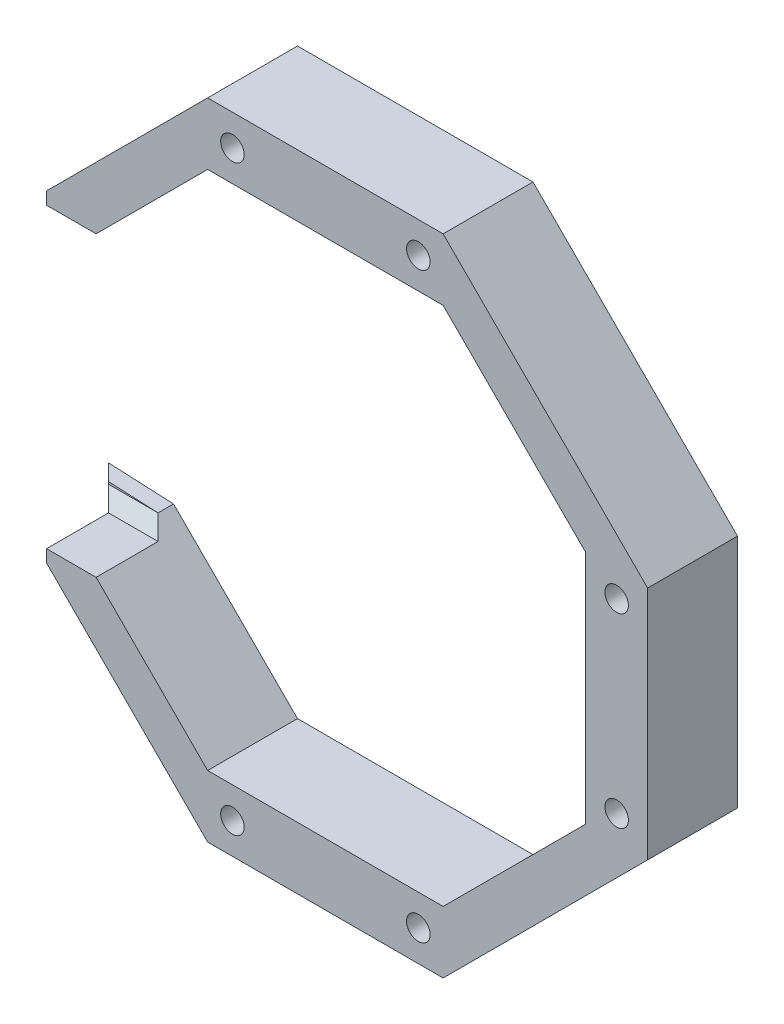
ISO-10303-21;
HEADER;
FILE_DESCRIPTION(('STEP AP214'),'2;1');
FILE_NAME('part.step','',(''),(''),'','','');
FILE_SCHEMA(('AUTOMOTIVE_DESIGN { 1 0 10303 214 1 1 1 1 }'));
ENDSEC;
DATA;
#1=APPLICATION_CONTEXT('core data for automotive mechanical design processes');
#2=APPLICATION_PROTOCOL_DEFINITION('international standard','automotive_design',2000,#1);
#3=PRODUCT_CONTEXT('',#1,'mechanical');
#4=PRODUCT('Part','Part','',(#3));
#5=PRODUCT_RELATED_PRODUCT_CATEGORY('part','',(#4));
#6=PRODUCT_DEFINITION_FORMATION('','',#4);
#7=PRODUCT_DEFINITION_CONTEXT('part definition',#1,'design');
#8=PRODUCT_DEFINITION('design','',#6,#7);
#9=PRODUCT_DEFINITION_SHAPE('','',#8);
#10=(LENGTH_UNIT() NAMED_UNIT(*) SI_UNIT(.MILLI.,.METRE.));
#11=(NAMED_UNIT(*) PLANE_ANGLE_UNIT() SI_UNIT($,.RADIAN.));
#12=(NAMED_UNIT(*) SI_UNIT($,.STERADIAN.) SOLID_ANGLE_UNIT());
#13=UNCERTAINTY_MEASURE_WITH_UNIT(LENGTH_MEASURE(1.E-05),#10,'distance_accuracy_value','');
#14=(GEOMETRIC_REPRESENTATION_CONTEXT(3) GLOBAL_UNCERTAINTY_ASSIGNED_CONTEXT((#13)) GLOBAL_UNIT_ASSIGNED_CONTEXT((#10,
#11,#12)) REPRESENTATION_CONTEXT('',''));
#15=CARTESIAN_POINT('',(0.,0.,0.));
#16=DIRECTION('',(0.,0.,1.));
#17=DIRECTION('',(1.,0.,0.));
#18=AXIS2_PLACEMENT_3D('',#15,#16,#17);
#19=CARTESIAN_POINT('',(0.,0.,-65.2));
#20=DIRECTION('',(0.,0.,1.));
#21=DIRECTION('',(1.,0.,0.));
#22=AXIS2_PLACEMENT_3D('',#19,#20,#21);
#23=PLANE('',#22);
#24=DIRECTION('',(-0.998868137724438,-0.0475651494154494,0.));
#25=VECTOR('',#24,1.);
#26=CARTESIAN_POINT('',(1.42103179550905,-29.84166770569,-65.2));
#27=LINE('',#26,#25);
#28=CARTESIAN_POINT('',(60.988658439,-27.005114056,-65.2));
#29=VERTEX_POINT('',#28);
#30=CARTESIAN_POINT('',(52.988658439,-27.3860664369524,-65.2));
#31=VERTEX_POINT('',#30);
#32=EDGE_CURVE('E374',#29,#31,#27,.T.);
#33=ORIENTED_EDGE('',*,*,#32,.F.);
#34=DIRECTION('',(1.,0.,0.));
#35=VECTOR('',#34,1.);
#36=CARTESIAN_POINT('',(36.8219917723334,-27.0051140559999,-65.2));
#37=LINE('',#36,#35);
#38=CARTESIAN_POINT('',(52.988658439,-27.005114056,-65.2));
#39=VERTEX_POINT('',#38);
#40=EDGE_CURVE('E418',#29,#39,#37,.F.);
#41=ORIENTED_EDGE('',*,*,#40,.T.);
#42=DIRECTION('',(0.,1.,0.));
#43=VECTOR('',#42,1.);
#44=CARTESIAN_POINT('',(52.988658439,-70.505114056,-65.2));
#45=LINE('',#44,#43);
#46=EDGE_CURVE('E65',#39,#31,#45,.F.);
#47=ORIENTED_EDGE('',*,*,#46,.T.);
#48=EDGE_LOOP('',(#33,#41,#47));
#49=FACE_BOUND('',#48,.T.);
#50=ADVANCED_FACE('F49',(#49),#23,.T.);
#51=CARTESIAN_POINT('',(50.488658439,-70.505114056,-67.7));
#52=DIRECTION('',(-0.70710678118655,0.,0.707106781186545));
#53=DIRECTION('',(0.707106781186545,0.,0.70710678118655));
#54=AXIS2_PLACEMENT_3D('',#51,#52,#53);
#55=PLANE('',#54);
#56=DIRECTION('',(-0.577350269189624,-0.577350269189624,-0.577350269189629));
#57=VECTOR('',#56,1.);
#58=CARTESIAN_POINT('',(36.1553251056667,-41.8384473893333,-82.0333333333334));
#59=LINE('',#58,#57);
#60=CARTESIAN_POINT('',(50.488658439,-27.505114056,-67.7));
#61=VERTEX_POINT('',#60);
#62=CARTESIAN_POINT('',(54.9886584389999,-23.005114056,-63.2));
#63=VERTEX_POINT('',#62);
#64=EDGE_CURVE('E353',#61,#63,#59,.F.);
#65=ORIENTED_EDGE('',*,*,#64,.F.);
#66=DIRECTION('',(-0.706706267542865,-0.0336526794068031,-0.70670626754287));
#67=VECTOR('',#66,1.);
#68=CARTESIAN_POINT('',(49.4660083823749,-27.5538116777441,-68.7226500566251));
#69=LINE('',#68,#67);
#70=EDGE_CURVE('E378',#61,#31,#69,.F.);
#71=ORIENTED_EDGE('',*,*,#70,.T.);
#72=ORIENTED_EDGE('',*,*,#46,.F.);
#73=DIRECTION('',(-0.577350269189624,-0.577350269189624,-0.577350269189629));
#74=VECTOR('',#73,1.);
#75=CARTESIAN_POINT('',(52.3219917723333,-27.6717807226667,-65.8666666666667));
#76=LINE('',#75,#74);
#77=CARTESIAN_POINT('',(54.9886584389999,-25.005114056,-63.2));
#78=VERTEX_POINT('',#77);
#79=EDGE_CURVE('E406',#39,#78,#76,.F.);
#80=ORIENTED_EDGE('',*,*,#79,.T.);
#81=DIRECTION('',(0.,1.,0.));
#82=VECTOR('',#81,1.);
#83=CARTESIAN_POINT('',(54.9886584389999,-70.505114056,-63.2));
#84=LINE('',#83,#82);
#85=EDGE_CURVE('E359',#63,#78,#84,.F.);
#86=ORIENTED_EDGE('',*,*,#85,.F.);
#87=EDGE_LOOP('',(#65,#71,#72,#80,#86));
#88=FACE_BOUND('',#87,.T.);
#89=ADVANCED_FACE('F305',(#88),#55,.T.);
#90=DIRECTION('',(0.998868137724438,-0.0475651494154494,0.));
#91=VECTOR('',#90,1.);
#92=CARTESIAN_POINT('',(-3.23556275279864,-67.9468178087715,-65.2));
#93=LINE('',#92,#91);
#94=CARTESIAN_POINT('',(52.988658439,-70.6241616750476,-65.2));
#95=VERTEX_POINT('',#94);
#96=CARTESIAN_POINT('',(60.988658439,-71.005114056,-65.2));
#97=VERTEX_POINT('',#96);
#98=EDGE_CURVE('E325',#95,#97,#93,.T.);
#99=ORIENTED_EDGE('',*,*,#98,.F.);
#100=CARTESIAN_POINT('',(52.988658439,-71.005114056,-65.2));
#101=VERTEX_POINT('',#100);
#102=EDGE_CURVE('E73',#95,#101,#45,.F.);
#103=ORIENTED_EDGE('',*,*,#102,.T.);
#104=DIRECTION('',(1.,0.,0.));
#105=VECTOR('',#104,1.);
#106=CARTESIAN_POINT('',(51.1553251056666,-71.005114056,-65.2));
#107=LINE('',#106,#105);
#108=EDGE_CURVE('E326',#101,#97,#107,.T.);
#109=ORIENTED_EDGE('',*,*,#108,.T.);
#110=EDGE_LOOP('',(#99,#103,#109));
#111=FACE_BOUND('',#110,.T.);
#112=ADVANCED_FACE('F308',(#111),#23,.T.);
#113=CARTESIAN_POINT('',(70.988658439,-81.005114056,-63.2));
#114=DIRECTION('',(-0.707106781186548,-0.707106781186548,0.));
#115=DIRECTION('',(-0.707106781186548,0.707106781186548,0.));
#116=AXIS2_PLACEMENT_3D('',#113,#114,#115);
#117=PLANE('',#116);
#118=DIRECTION('',(0.,0.,-1.));
#119=VECTOR('',#118,1.);
#120=CARTESIAN_POINT('',(60.988658439,-71.005114056,-65.2));
#121=LINE('',#120,#119);
#122=CARTESIAN_POINT('',(60.988658439,-71.005114056,-67.7));
#123=VERTEX_POINT('',#122);
#124=EDGE_CURVE('E720',#97,#123,#121,.T.);
#125=ORIENTED_EDGE('',*,*,#124,.F.);
#126=DIRECTION('',(0.577350269189625,-0.577350269189625,0.577350269189629));
#127=VECTOR('',#126,1.);
#128=CARTESIAN_POINT('',(68.3219917723333,-78.3384473893333,-57.8666666666667));
#129=LINE('',#128,#127);
#130=CARTESIAN_POINT('',(62.988658439,-73.005114056,-63.2));
#131=VERTEX_POINT('',#130);
#132=EDGE_CURVE('E415',#97,#131,#129,.T.);
#133=ORIENTED_EDGE('',*,*,#132,.T.);
#134=DIRECTION('',(0.,0.,-1.));
#135=VECTOR('',#134,1.);
#136=CARTESIAN_POINT('',(62.988658439,-73.005114056,-53.2));
#137=LINE('',#136,#135);
#138=CARTESIAN_POINT('',(62.988658439,-73.005114056,-53.2));
#139=VERTEX_POINT('',#138);
#140=EDGE_CURVE('E602',#139,#131,#137,.T.);
#141=ORIENTED_EDGE('',*,*,#140,.F.);
#142=DIRECTION('',(-0.707106781186547,0.707106781186547,0.));
#143=VECTOR('',#142,1.);
#144=CARTESIAN_POINT('',(62.988658439,-73.005114056,-53.2));
#145=LINE('',#144,#143);
#146=CARTESIAN_POINT('',(80.988658439,-91.005114056,-53.2));
#147=VERTEX_POINT('',#146);
#148=EDGE_CURVE('E879',#147,#139,#145,.T.);
#149=ORIENTED_EDGE('',*,*,#148,.F.);
#150=DIRECTION('',(0.,0.,-1.));
#151=VECTOR('',#150,1.);
#152=CARTESIAN_POINT('',(80.988658439,-91.005114056,-63.2));
#153=LINE('',#152,#151);
#154=CARTESIAN_POINT('',(80.988658439,-91.005114056,-67.7));
#155=VERTEX_POINT('',#154);
#156=EDGE_CURVE('E687',#147,#155,#153,.T.);
#157=ORIENTED_EDGE('',*,*,#156,.T.);
#158=DIRECTION('',(-0.707106781186548,0.707106781186548,0.));
#159=VECTOR('',#158,1.);
#160=CARTESIAN_POINT('',(80.988658439,-91.005114056,-67.7));
#161=LINE('',#160,#159);
#162=EDGE_CURVE('E363',#155,#123,#161,.T.);
#163=ORIENTED_EDGE('',*,*,#162,.T.);
#164=EDGE_LOOP('',(#125,#133,#141,#149,#157,#163));
#165=FACE_BOUND('',#164,.T.);
#166=ADVANCED_FACE('F318',(#165),#117,.F.);
#167=CARTESIAN_POINT('',(99.988658439,-91.005114056,-63.2));
#168=DIRECTION('',(0.,-1.,0.));
#169=DIRECTION('',(0.,0.,-1.));
#170=AXIS2_PLACEMENT_3D('',#167,#168,#169);
#171=PLANE('',#170);
#172=ORIENTED_EDGE('',*,*,#156,.F.);
#173=DIRECTION('',(-1.,0.,0.));
#174=VECTOR('',#173,1.);
#175=CARTESIAN_POINT('',(80.988658439,-91.005114056,-53.2));
#176=LINE('',#175,#174);
#177=CARTESIAN_POINT('',(118.988658439,-91.005114056,-53.2));
#178=VERTEX_POINT('',#177);
#179=EDGE_CURVE('E877',#178,#147,#176,.T.);
#180=ORIENTED_EDGE('',*,*,#179,.F.);
#181=DIRECTION('',(0.,0.,-1.));
#182=VECTOR('',#181,1.);
#183=CARTESIAN_POINT('',(118.988658439,-91.005114056,-63.2));
#184=LINE('',#183,#182);
#185=CARTESIAN_POINT('',(118.988658439,-91.005114056,-67.7));
#186=VERTEX_POINT('',#185);
#187=EDGE_CURVE('E345',#178,#186,#184,.T.);
#188=ORIENTED_EDGE('',*,*,#187,.T.);
#189=DIRECTION('',(-1.,0.,0.));
#190=VECTOR('',#189,1.);
#191=CARTESIAN_POINT('',(118.988658439,-91.005114056,-67.7));
#192=LINE('',#191,#190);
#193=EDGE_CURVE('E703',#186,#155,#192,.T.);
#194=ORIENTED_EDGE('',*,*,#193,.T.);
#195=EDGE_LOOP('',(#172,#180,#188,#194));
#196=FACE_BOUND('',#195,.T.);
#197=ADVANCED_FACE('F322',(#196),#171,.F.);
#198=CARTESIAN_POINT('',(64.488658439,-84.505114056,-63.2));
#199=DIRECTION('',(-0.707106781186548,-0.707106781186548,0.));
#200=DIRECTION('',(-0.707106781186548,0.707106781186548,0.));
#201=AXIS2_PLACEMENT_3D('',#198,#199,#200);
#202=PLANE('',#201);
#203=DIRECTION('',(-0.707106781186548,0.707106781186548,0.));
#204=VECTOR('',#203,1.);
#205=CARTESIAN_POINT('',(80.988658439,-101.005114056,-67.7));
#206=LINE('',#205,#204);
#207=CARTESIAN_POINT('',(80.9886584389999,-101.005114056,-67.7));
#208=VERTEX_POINT('',#207);
#209=CARTESIAN_POINT('',(50.488658439,-70.505114056,-67.7));
#210=VERTEX_POINT('',#209);
#211=EDGE_CURVE('E352',#208,#210,#206,.T.);
#212=ORIENTED_EDGE('',*,*,#211,.F.);
#213=DIRECTION('',(0.,0.,1.));
#214=VECTOR('',#213,1.);
#215=CARTESIAN_POINT('',(80.9886584389999,-101.005114056,-63.2));
#216=LINE('',#215,#214);
#217=CARTESIAN_POINT('',(80.9886584389999,-101.005114056,-53.2));
#218=VERTEX_POINT('',#217);
#219=EDGE_CURVE('E403',#208,#218,#216,.T.);
#220=ORIENTED_EDGE('',*,*,#219,.T.);
#221=DIRECTION('',(0.707106781186547,-0.707106781186547,0.));
#222=VECTOR('',#221,1.);
#223=CARTESIAN_POINT('',(80.9886584389999,-101.005114056,-53.2));
#224=LINE('',#223,#222);
#225=CARTESIAN_POINT('',(54.988658439,-75.005114056,-53.2));
#226=VERTEX_POINT('',#225);
#227=EDGE_CURVE('E888',#226,#218,#224,.T.);
#228=ORIENTED_EDGE('',*,*,#227,.F.);
#229=DIRECTION('',(0.,0.,-1.));
#230=VECTOR('',#229,1.);
#231=CARTESIAN_POINT('',(54.988658439,-75.005114056,-53.2));
#232=LINE('',#231,#230);
#233=CARTESIAN_POINT('',(54.988658439,-75.005114056,-63.2));
#234=VERTEX_POINT('',#233);
#235=EDGE_CURVE('E596',#226,#234,#232,.T.);
#236=ORIENTED_EDGE('',*,*,#235,.T.);
#237=DIRECTION('',(0.577350269189624,-0.577350269189624,0.577350269189629));
#238=VECTOR('',#237,1.);
#239=CARTESIAN_POINT('',(50.488658439,-70.505114056,-67.7));
#240=LINE('',#239,#238);
#241=EDGE_CURVE('E341',#234,#210,#240,.F.);
#242=ORIENTED_EDGE('',*,*,#241,.T.);
#243=EDGE_LOOP('',(#212,#220,#228,#236,#242));
#244=FACE_BOUND('',#243,.T.);
#245=ADVANCED_FACE('F530',(#244),#202,.T.);
#246=ORIENTED_EDGE('',*,*,#102,.F.);
#247=DIRECTION('',(0.706706267542865,-0.0336526794068031,0.70670626754287));
#248=VECTOR('',#247,1.);
#249=CARTESIAN_POINT('',(50.488658439,-70.505114056,-67.7));
#250=LINE('',#249,#248);
#251=EDGE_CURVE('E330',#95,#210,#250,.F.);
#252=ORIENTED_EDGE('',*,*,#251,.T.);
#253=ORIENTED_EDGE('',*,*,#241,.F.);
#254=DIRECTION('',(0.,1.,0.));
#255=VECTOR('',#254,1.);
#256=CARTESIAN_POINT('',(54.9886584389999,-70.505114056,-63.2));
#257=LINE('',#256,#255);
#258=CARTESIAN_POINT('',(54.9886584389999,-73.005114056,-63.2));
#259=VERTEX_POINT('',#258);
#260=EDGE_CURVE('E339',#259,#234,#257,.F.);
#261=ORIENTED_EDGE('',*,*,#260,.F.);
#262=DIRECTION('',(0.577350269189624,-0.577350269189624,0.577350269189629));
#263=VECTOR('',#262,1.);
#264=CARTESIAN_POINT('',(51.1553251056666,-69.1717807226667,-67.0333333333333));
#265=LINE('',#264,#263);
#266=EDGE_CURVE('E338',#259,#101,#265,.F.);
#267=ORIENTED_EDGE('',*,*,#266,.T.);
#268=EDGE_LOOP('',(#246,#252,#253,#261,#267));
#269=FACE_BOUND('',#268,.T.);
#270=ADVANCED_FACE('F313',(#269),#55,.T.);
#271=CARTESIAN_POINT('',(-96.011341561,-266.005114056,-67.7));
#272=DIRECTION('',(0.,0.,1.));
#273=DIRECTION('',(1.,0.,0.));
#274=AXIS2_PLACEMENT_3D('',#271,#272,#273);
#275=PLANE('',#274);
#276=CARTESIAN_POINT('',(114.988658439,-2.005114056,-67.7));
#277=DIRECTION('',(0.,0.,1.));
#278=DIRECTION('',(1.,0.,0.));
#279=AXIS2_PLACEMENT_3D('',#276,#277,#278);
#280=CIRCLE('',#279,4.7);
#281=CARTESIAN_POINT('',(119.688658439,-2.005114056,-67.7));
#282=VERTEX_POINT('',#281);
#283=EDGE_CURVE('E439',#282,#282,#280,.T.);
#284=ORIENTED_EDGE('',*,*,#283,.T.);
#285=EDGE_LOOP('',(#284));
#286=FACE_BOUND('',#285,.T.);
#287=CARTESIAN_POINT('',(84.988658439,-2.005114056,-67.7));
#288=DIRECTION('',(0.,0.,1.));
#289=DIRECTION('',(1.,0.,0.));
#290=AXIS2_PLACEMENT_3D('',#287,#288,#289);
#291=CIRCLE('',#290,4.7);
#292=CARTESIAN_POINT('',(89.688658439,-2.005114056,-67.7));
#293=VERTEX_POINT('',#292);
#294=EDGE_CURVE('E436',#293,#293,#291,.T.);
#295=ORIENTED_EDGE('',*,*,#294,.T.);
#296=EDGE_LOOP('',(#295));
#297=FACE_BOUND('',#296,.T.);
#298=CARTESIAN_POINT('',(84.988658439,-96.005114056,-67.7));
#299=DIRECTION('',(0.,0.,1.));
#300=DIRECTION('',(1.,0.,0.));
#301=AXIS2_PLACEMENT_3D('',#298,#299,#300);
#302=CIRCLE('',#301,4.7);
#303=CARTESIAN_POINT('',(89.688658439,-96.005114056,-67.7));
#304=VERTEX_POINT('',#303);
#305=EDGE_CURVE('E433',#304,#304,#302,.T.);
#306=ORIENTED_EDGE('',*,*,#305,.T.);
#307=EDGE_LOOP('',(#306));
#308=FACE_BOUND('',#307,.T.);
#309=CARTESIAN_POINT('',(114.988658439,-96.005114056,-67.7));
#310=DIRECTION('',(0.,0.,1.));
#311=DIRECTION('',(1.,0.,0.));
#312=AXIS2_PLACEMENT_3D('',#309,#310,#311);
#313=CIRCLE('',#312,4.7);
#314=CARTESIAN_POINT('',(119.688658439,-96.005114056,-67.7));
#315=VERTEX_POINT('',#314);
#316=EDGE_CURVE('E430',#315,#315,#313,.T.);
#317=ORIENTED_EDGE('',*,*,#316,.T.);
#318=EDGE_LOOP('',(#317));
#319=FACE_BOUND('',#318,.T.);
#320=CARTESIAN_POINT('',(146.988658439,-64.005114056,-67.7));
#321=DIRECTION('',(0.,0.,1.));
#322=DIRECTION('',(1.,0.,0.));
#323=AXIS2_PLACEMENT_3D('',#320,#321,#322);
#324=CIRCLE('',#323,4.69999999999995);
#325=CARTESIAN_POINT('',(151.688658439,-64.005114056,-67.7));
#326=VERTEX_POINT('',#325);
#327=EDGE_CURVE('E427',#326,#326,#324,.T.);
#328=ORIENTED_EDGE('',*,*,#327,.T.);
#329=EDGE_LOOP('',(#328));
#330=FACE_BOUND('',#329,.T.);
#331=CARTESIAN_POINT('',(146.988658439,-34.005114056,-67.7));
#332=DIRECTION('',(0.,0.,1.));
#333=DIRECTION('',(1.,0.,0.));
#334=AXIS2_PLACEMENT_3D('',#331,#332,#333);
#335=CIRCLE('',#334,4.69999999999995);
#336=CARTESIAN_POINT('',(151.688658439,-34.005114056,-67.7));
#337=VERTEX_POINT('',#336);
#338=EDGE_CURVE('E424',#337,#337,#335,.T.);
#339=ORIENTED_EDGE('',*,*,#338,.T.);
#340=EDGE_LOOP('',(#339));
#341=FACE_BOUND('',#340,.T.);
#342=DIRECTION('',(-0.707106781186548,-0.707106781186548,0.));
#343=VECTOR('',#342,1.);
#344=CARTESIAN_POINT('',(80.988658439,-7.005114056,-67.7));
#345=LINE('',#344,#343);
#346=CARTESIAN_POINT('',(80.988658439,-7.005114056,-67.7));
#347=VERTEX_POINT('',#346);
#348=CARTESIAN_POINT('',(60.988658439,-27.005114056,-67.7));
#349=VERTEX_POINT('',#348);
#350=EDGE_CURVE('E218',#347,#349,#345,.T.);
#351=ORIENTED_EDGE('',*,*,#350,.T.);
#352=DIRECTION('',(0.998868137724438,0.0475651494154494,0.));
#353=VECTOR('',#352,1.);
#354=CARTESIAN_POINT('',(60.988658439,-27.005114056,-67.7));
#355=LINE('',#354,#353);
#356=EDGE_CURVE('E605',#61,#349,#355,.T.);
#357=ORIENTED_EDGE('',*,*,#356,.F.);
#358=DIRECTION('',(0.707106781186548,0.707106781186548,0.));
#359=VECTOR('',#358,1.);
#360=CARTESIAN_POINT('',(50.488658439,-27.505114056,-67.7));
#361=LINE('',#360,#359);
#362=CARTESIAN_POINT('',(80.9886584390001,2.9948859440001,-67.7));
#363=VERTEX_POINT('',#362);
#364=EDGE_CURVE('E358',#61,#363,#361,.T.);
#365=ORIENTED_EDGE('',*,*,#364,.T.);
#366=DIRECTION('',(1.,0.,0.));
#367=VECTOR('',#366,1.);
#368=CARTESIAN_POINT('',(80.988658439,2.99488594400005,-67.7));
#369=LINE('',#368,#367);
#370=CARTESIAN_POINT('',(118.988658439,2.99488594399994,-67.7));
#371=VERTEX_POINT('',#370);
#372=EDGE_CURVE('E396',#363,#371,#369,.T.);
#373=ORIENTED_EDGE('',*,*,#372,.T.);
#374=DIRECTION('',(-0.707106781186548,0.707106781186548,0.));
#375=VECTOR('',#374,1.);
#376=CARTESIAN_POINT('',(151.988658439,-30.005114056,-67.7));
#377=LINE('',#376,#375);
#378=CARTESIAN_POINT('',(151.988658439,-30.005114056,-67.7));
#379=VERTEX_POINT('',#378);
#380=EDGE_CURVE('E571',#379,#371,#377,.T.);
#381=ORIENTED_EDGE('',*,*,#380,.F.);
#382=DIRECTION('',(0.,1.,0.));
#383=VECTOR('',#382,1.);
#384=CARTESIAN_POINT('',(151.988658439,-68.005114056,-67.7));
#385=LINE('',#384,#383);
#386=CARTESIAN_POINT('',(151.988658439,-68.005114056,-67.7));
#387=VERTEX_POINT('',#386);
#388=EDGE_CURVE('E398',#379,#387,#385,.F.);
#389=ORIENTED_EDGE('',*,*,#388,.T.);
#390=DIRECTION('',(0.707106781186547,0.707106781186548,0.));
#391=VECTOR('',#390,1.);
#392=CARTESIAN_POINT('',(170.988658439,-49.005114056,-67.7));
#393=LINE('',#392,#391);
#394=CARTESIAN_POINT('',(118.988658439,-101.005114056,-67.7));
#395=VERTEX_POINT('',#394);
#396=EDGE_CURVE('E342',#395,#387,#393,.T.);
#397=ORIENTED_EDGE('',*,*,#396,.F.);
#398=DIRECTION('',(-1.,0.,0.));
#399=VECTOR('',#398,1.);
#400=CARTESIAN_POINT('',(118.988658439,-101.005114056,-67.7));
#401=LINE('',#400,#399);
#402=EDGE_CURVE('E394',#395,#208,#401,.T.);
#403=ORIENTED_EDGE('',*,*,#402,.T.);
#404=ORIENTED_EDGE('',*,*,#211,.T.);
#405=DIRECTION('',(-0.998868137724438,0.0475651494154494,0.));
#406=VECTOR('',#405,1.);
#407=CARTESIAN_POINT('',(50.488658439,-70.505114056,-67.7));
#408=LINE('',#407,#406);
#409=EDGE_CURVE('E604',#123,#210,#408,.T.);
#410=ORIENTED_EDGE('',*,*,#409,.F.);
#411=ORIENTED_EDGE('',*,*,#162,.F.);
#412=ORIENTED_EDGE('',*,*,#193,.F.);
#413=DIRECTION('',(0.707106781186547,0.707106781186548,0.));
#414=VECTOR('',#413,1.);
#415=CARTESIAN_POINT('',(165.988658439,-44.005114056,-67.7));
#416=LINE('',#415,#414);
#417=CARTESIAN_POINT('',(141.988658439,-68.0051140559999,-67.7));
#418=VERTEX_POINT('',#417);
#419=EDGE_CURVE('E329',#186,#418,#416,.T.);
#420=ORIENTED_EDGE('',*,*,#419,.T.);
#421=DIRECTION('',(0.,-1.,0.));
#422=VECTOR('',#421,1.);
#423=CARTESIAN_POINT('',(141.988658439,-30.005114056,-67.7));
#424=LINE('',#423,#422);
#425=CARTESIAN_POINT('',(141.988658439,-30.005114056,-67.7));
#426=VERTEX_POINT('',#425);
#427=EDGE_CURVE('E697',#426,#418,#424,.T.);
#428=ORIENTED_EDGE('',*,*,#427,.F.);
#429=DIRECTION('',(0.707106781186548,-0.707106781186548,0.));
#430=VECTOR('',#429,1.);
#431=CARTESIAN_POINT('',(118.988658439,-7.005114056,-67.7));
#432=LINE('',#431,#430);
#433=CARTESIAN_POINT('',(118.988658439,-7.005114056,-67.7));
#434=VERTEX_POINT('',#433);
#435=EDGE_CURVE('E681',#434,#426,#432,.T.);
#436=ORIENTED_EDGE('',*,*,#435,.F.);
#437=DIRECTION('',(1.,0.,0.));
#438=VECTOR('',#437,1.);
#439=CARTESIAN_POINT('',(80.988658439,-7.005114056,-67.7));
#440=LINE('',#439,#438);
#441=EDGE_CURVE('E222',#347,#434,#440,.T.);
#442=ORIENTED_EDGE('',*,*,#441,.F.);
#443=EDGE_LOOP('',(#351,#357,#365,#373,#381,#389,#397,#403,#404,#410,#411,#412,#420,#428,#436,#442));
#444=FACE_BOUND('',#443,.T.);
#445=ADVANCED_FACE('F529',(#286,#297,#308,#319,#330,#341,#444),#275,.F.);
#446=CARTESIAN_POINT('',(141.988658439,-49.005114056,-63.2));
#447=DIRECTION('',(1.,0.,0.));
#448=DIRECTION('',(0.,1.,0.));
#449=AXIS2_PLACEMENT_3D('',#446,#447,#448);
#450=PLANE('',#449);
#451=ORIENTED_EDGE('',*,*,#427,.T.);
#452=DIRECTION('',(0.,0.,-1.));
#453=VECTOR('',#452,1.);
#454=CARTESIAN_POINT('',(141.988658439,-68.005114056,-63.2));
#455=LINE('',#454,#453);
#456=CARTESIAN_POINT('',(141.988658439,-68.0051140559999,-53.2));
#457=VERTEX_POINT('',#456);
#458=EDGE_CURVE('E702',#457,#418,#455,.T.);
#459=ORIENTED_EDGE('',*,*,#458,.F.);
#460=DIRECTION('',(0.,-1.,0.));
#461=VECTOR('',#460,1.);
#462=CARTESIAN_POINT('',(141.988658439,-68.0051140559999,-53.2));
#463=LINE('',#462,#461);
#464=CARTESIAN_POINT('',(141.988658439,-30.005114056,-53.2));
#465=VERTEX_POINT('',#464);
#466=EDGE_CURVE('E873',#465,#457,#463,.T.);
#467=ORIENTED_EDGE('',*,*,#466,.F.);
#468=DIRECTION('',(0.,0.,-1.));
#469=VECTOR('',#468,1.);
#470=CARTESIAN_POINT('',(141.988658439,-30.005114056,-63.2));
#471=LINE('',#470,#469);
#472=EDGE_CURVE('E686',#465,#426,#471,.T.);
#473=ORIENTED_EDGE('',*,*,#472,.T.);
#474=EDGE_LOOP('',(#451,#459,#467,#473));
#475=FACE_BOUND('',#474,.T.);
#476=ADVANCED_FACE('F541',(#475),#450,.F.);
#477=CARTESIAN_POINT('',(130.488658439,-18.505114056,-63.2));
#478=DIRECTION('',(0.707106781186548,0.707106781186548,0.));
#479=DIRECTION('',(0.,0.,-1.));
#480=AXIS2_PLACEMENT_3D('',#477,#478,#479);
#481=PLANE('',#480);
#482=ORIENTED_EDGE('',*,*,#435,.T.);
#483=ORIENTED_EDGE('',*,*,#472,.F.);
#484=DIRECTION('',(0.707106781186548,-0.707106781186548,0.));
#485=VECTOR('',#484,1.);
#486=CARTESIAN_POINT('',(141.988658439,-30.005114056,-53.2));
#487=LINE('',#486,#485);
#488=CARTESIAN_POINT('',(118.988658439,-7.005114056,-53.2));
#489=VERTEX_POINT('',#488);
#490=EDGE_CURVE('E232',#489,#465,#487,.T.);
#491=ORIENTED_EDGE('',*,*,#490,.F.);
#492=DIRECTION('',(0.,0.,-1.));
#493=VECTOR('',#492,1.);
#494=CARTESIAN_POINT('',(118.988658439,-7.005114056,-63.2));
#495=LINE('',#494,#493);
#496=EDGE_CURVE('E228',#489,#434,#495,.T.);
#497=ORIENTED_EDGE('',*,*,#496,.T.);
#498=EDGE_LOOP('',(#482,#483,#491,#497));
#499=FACE_BOUND('',#498,.T.);
#500=ADVANCED_FACE('F540',(#499),#481,.F.);
#501=CARTESIAN_POINT('',(99.988658439,-7.005114056,-63.2));
#502=DIRECTION('',(0.,1.,0.));
#503=DIRECTION('',(1.,0.,0.));
#504=AXIS2_PLACEMENT_3D('',#501,#502,#503);
#505=PLANE('',#504);
#506=ORIENTED_EDGE('',*,*,#441,.T.);
#507=ORIENTED_EDGE('',*,*,#496,.F.);
#508=DIRECTION('',(1.,0.,0.));
#509=VECTOR('',#508,1.);
#510=CARTESIAN_POINT('',(118.988658439,-7.005114056,-53.2));
#511=LINE('',#510,#509);
#512=CARTESIAN_POINT('',(80.988658439,-7.005114056,-53.2));
#513=VERTEX_POINT('',#512);
#514=EDGE_CURVE('E225',#513,#489,#511,.T.);
#515=ORIENTED_EDGE('',*,*,#514,.F.);
#516=DIRECTION('',(0.,0.,-1.));
#517=VECTOR('',#516,1.);
#518=CARTESIAN_POINT('',(80.988658439,-7.005114056,-63.2));
#519=LINE('',#518,#517);
#520=EDGE_CURVE('E210',#513,#347,#519,.T.);
#521=ORIENTED_EDGE('',*,*,#520,.T.);
#522=EDGE_LOOP('',(#506,#507,#515,#521));
#523=FACE_BOUND('',#522,.T.);
#524=ADVANCED_FACE('F226',(#523),#505,.F.);
#525=CARTESIAN_POINT('',(70.988658439,-17.005114056,-63.2));
#526=DIRECTION('',(0.707106781186548,-0.707106781186548,0.));
#527=DIRECTION('',(0.,0.,-1.));
#528=AXIS2_PLACEMENT_3D('',#525,#526,#527);
#529=PLANE('',#528);
#530=ORIENTED_EDGE('',*,*,#520,.F.);
#531=DIRECTION('',(0.707106781186548,0.707106781186547,0.));
#532=VECTOR('',#531,1.);
#533=CARTESIAN_POINT('',(80.988658439,-7.005114056,-53.2));
#534=LINE('',#533,#532);
#535=CARTESIAN_POINT('',(62.988658439,-25.005114056,-53.2));
#536=VERTEX_POINT('',#535);
#537=EDGE_CURVE('E215',#536,#513,#534,.T.);
#538=ORIENTED_EDGE('',*,*,#537,.F.);
#539=DIRECTION('',(0.,0.,-1.));
#540=VECTOR('',#539,1.);
#541=CARTESIAN_POINT('',(62.988658439,-25.005114056,-53.2));
#542=LINE('',#541,#540);
#543=CARTESIAN_POINT('',(62.988658439,-25.005114056,-63.2));
#544=VERTEX_POINT('',#543);
#545=EDGE_CURVE('E589',#536,#544,#542,.T.);
#546=ORIENTED_EDGE('',*,*,#545,.T.);
#547=DIRECTION('',(-0.577350269189625,-0.577350269189625,-0.577350269189629));
#548=VECTOR('',#547,1.);
#549=CARTESIAN_POINT('',(55.6553251056667,-32.3384473893333,-70.5333333333334));
#550=LINE('',#549,#548);
#551=EDGE_CURVE('E412',#544,#29,#550,.T.);
#552=ORIENTED_EDGE('',*,*,#551,.T.);
#553=DIRECTION('',(0.,0.,-1.));
#554=VECTOR('',#553,1.);
#555=CARTESIAN_POINT('',(60.988658439,-27.005114056,-65.2));
#556=LINE('',#555,#554);
#557=EDGE_CURVE('E357',#29,#349,#556,.T.);
#558=ORIENTED_EDGE('',*,*,#557,.T.);
#559=ORIENTED_EDGE('',*,*,#350,.F.);
#560=EDGE_LOOP('',(#530,#538,#546,#552,#558,#559));
#561=FACE_BOUND('',#560,.T.);
#562=ADVANCED_FACE('F212',(#561),#529,.T.);
#563=CARTESIAN_POINT('',(64.488658439,-13.505114056,-63.2));
#564=DIRECTION('',(-0.707106781186548,0.707106781186548,0.));
#565=DIRECTION('',(0.,0.,1.));
#566=AXIS2_PLACEMENT_3D('',#563,#564,#565);
#567=PLANE('',#566);
#568=ORIENTED_EDGE('',*,*,#64,.T.);
#569=DIRECTION('',(0.,0.,-1.));
#570=VECTOR('',#569,1.);
#571=CARTESIAN_POINT('',(54.9886584389999,-23.005114056,-53.2));
#572=LINE('',#571,#570);
#573=CARTESIAN_POINT('',(54.9886584389999,-23.005114056,-53.2));
#574=VERTEX_POINT('',#573);
#575=EDGE_CURVE('E594',#574,#63,#572,.T.);
#576=ORIENTED_EDGE('',*,*,#575,.F.);
#577=DIRECTION('',(-0.707106781186547,-0.707106781186547,0.));
#578=VECTOR('',#577,1.);
#579=CARTESIAN_POINT('',(54.9886584389999,-23.005114056,-53.2));
#580=LINE('',#579,#578);
#581=CARTESIAN_POINT('',(80.9886584390001,2.99488594400008,-53.2));
#582=VERTEX_POINT('',#581);
#583=EDGE_CURVE('E581',#582,#574,#580,.T.);
#584=ORIENTED_EDGE('',*,*,#583,.F.);
#585=DIRECTION('',(0.,0.,-1.));
#586=VECTOR('',#585,1.);
#587=CARTESIAN_POINT('',(80.988658439,2.99488594400005,-67.7));
#588=LINE('',#587,#586);
#589=EDGE_CURVE('E399',#582,#363,#588,.T.);
#590=ORIENTED_EDGE('',*,*,#589,.T.);
#591=ORIENTED_EDGE('',*,*,#364,.F.);
#592=EDGE_LOOP('',(#568,#576,#584,#590,#591));
#593=FACE_BOUND('',#592,.T.);
#594=ADVANCED_FACE('F545',(#593),#567,.T.);
#595=CARTESIAN_POINT('',(135.488658439,-13.505114056,-63.2));
#596=DIRECTION('',(-0.707106781186548,-0.707106781186548,0.));
#597=DIRECTION('',(-0.707106781186548,0.707106781186548,0.));
#598=AXIS2_PLACEMENT_3D('',#595,#596,#597);
#599=PLANE('',#598);
#600=DIRECTION('',(0.,0.,1.));
#601=VECTOR('',#600,1.);
#602=CARTESIAN_POINT('',(118.988658439,2.99488594399988,-63.2));
#603=LINE('',#602,#601);
#604=CARTESIAN_POINT('',(118.988658439,2.99488594399994,-53.2));
#605=VERTEX_POINT('',#604);
#606=EDGE_CURVE('E389',#371,#605,#603,.T.);
#607=ORIENTED_EDGE('',*,*,#606,.T.);
#608=DIRECTION('',(-0.707106781186548,0.707106781186548,0.));
#609=VECTOR('',#608,1.);
#610=CARTESIAN_POINT('',(118.988658439,2.99488594399994,-53.2));
#611=LINE('',#610,#609);
#612=CARTESIAN_POINT('',(151.988658439,-30.005114056,-53.2));
#613=VERTEX_POINT('',#612);
#614=EDGE_CURVE('E569',#613,#605,#611,.T.);
#615=ORIENTED_EDGE('',*,*,#614,.F.);
#616=DIRECTION('',(0.,0.,-1.));
#617=VECTOR('',#616,1.);
#618=CARTESIAN_POINT('',(151.988658439,-30.005114056,-63.2));
#619=LINE('',#618,#617);
#620=EDGE_CURVE('E392',#613,#379,#619,.T.);
#621=ORIENTED_EDGE('',*,*,#620,.T.);
#622=ORIENTED_EDGE('',*,*,#380,.T.);
#623=EDGE_LOOP('',(#607,#615,#621,#622));
#624=FACE_BOUND('',#623,.T.);
#625=ADVANCED_FACE('F548',(#624),#599,.F.);
#626=CARTESIAN_POINT('',(104.9968862475,-104.9968862475,0.));
#627=DIRECTION('',(-0.707106781186548,0.707106781186547,0.));
#628=DIRECTION('',(-0.707106781186547,-0.707106781186548,0.));
#629=AXIS2_PLACEMENT_3D('',#626,#627,#628);
#630=PLANE('',#629);
#631=ORIENTED_EDGE('',*,*,#187,.F.);
#632=DIRECTION('',(-0.707106781186548,-0.707106781186547,0.));
#633=VECTOR('',#632,1.);
#634=CARTESIAN_POINT('',(118.988658439,-91.005114056,-53.2));
#635=LINE('',#634,#633);
#636=EDGE_CURVE('E875',#457,#178,#635,.T.);
#637=ORIENTED_EDGE('',*,*,#636,.F.);
#638=ORIENTED_EDGE('',*,*,#458,.T.);
#639=ORIENTED_EDGE('',*,*,#419,.F.);
#640=EDGE_LOOP('',(#631,#637,#638,#639));
#641=FACE_BOUND('',#640,.T.);
#642=ADVANCED_FACE('F558',(#641),#630,.T.);
#643=CARTESIAN_POINT('',(109.9968862475,-109.9968862475,0.));
#644=DIRECTION('',(-0.707106781186548,0.707106781186547,0.));
#645=DIRECTION('',(-0.707106781186547,-0.707106781186548,0.));
#646=AXIS2_PLACEMENT_3D('',#643,#644,#645);
#647=PLANE('',#646);
#648=ORIENTED_EDGE('',*,*,#396,.T.);
#649=DIRECTION('',(0.,0.,1.));
#650=VECTOR('',#649,1.);
#651=CARTESIAN_POINT('',(151.988658439,-68.005114056,0.));
#652=LINE('',#651,#650);
#653=CARTESIAN_POINT('',(151.988658439,-68.005114056,-53.2));
#654=VERTEX_POINT('',#653);
#655=EDGE_CURVE('E367',#387,#654,#652,.T.);
#656=ORIENTED_EDGE('',*,*,#655,.T.);
#657=DIRECTION('',(0.707106781186547,0.707106781186548,0.));
#658=VECTOR('',#657,1.);
#659=CARTESIAN_POINT('',(151.988658439,-68.005114056,-53.2));
#660=LINE('',#659,#658);
#661=CARTESIAN_POINT('',(118.988658439,-101.005114056,-53.2));
#662=VERTEX_POINT('',#661);
#663=EDGE_CURVE('E894',#662,#654,#660,.T.);
#664=ORIENTED_EDGE('',*,*,#663,.F.);
#665=DIRECTION('',(0.,0.,-1.));
#666=VECTOR('',#665,1.);
#667=CARTESIAN_POINT('',(118.988658439,-101.005114056,-67.7));
#668=LINE('',#667,#666);
#669=EDGE_CURVE('E362',#662,#395,#668,.T.);
#670=ORIENTED_EDGE('',*,*,#669,.T.);
#671=EDGE_LOOP('',(#648,#656,#664,#670));
#672=FACE_BOUND('',#671,.T.);
#673=ADVANCED_FACE('F563',(#672),#647,.F.);
#674=CARTESIAN_POINT('',(114.988658439,-2.005114056,-67.7));
#675=DIRECTION('',(0.,0.,-1.));
#676=DIRECTION('',(-1.,0.,0.));
#677=AXIS2_PLACEMENT_3D('',#674,#675,#676);
#678=CYLINDRICAL_SURFACE('',#677,1.89999999999999);
#679=CARTESIAN_POINT('',(114.988658439,-2.005114056,-64.9));
#680=DIRECTION('',(0.,0.,1.));
#681=DIRECTION('',(1.,0.,0.));
#682=AXIS2_PLACEMENT_3D('',#679,#680,#681);
#683=CIRCLE('',#682,1.89999999999999);
#684=CARTESIAN_POINT('',(116.888658439,-2.005114056,-64.9));
#685=VERTEX_POINT('',#684);
#686=EDGE_CURVE('E421',#685,#685,#683,.F.);
#687=ORIENTED_EDGE('',*,*,#686,.T.);
#688=EDGE_LOOP('',(#687));
#689=FACE_BOUND('',#688,.T.);
#690=CARTESIAN_POINT('',(114.988658439,-2.005114056,-53.2));
#691=DIRECTION('',(0.,0.,1.));
#692=DIRECTION('',(1.,0.,0.));
#693=AXIS2_PLACEMENT_3D('',#690,#691,#692);
#694=CIRCLE('',#693,1.89999999999999);
#695=CARTESIAN_POINT('',(116.888658439,-2.005114056,-53.2));
#696=VERTEX_POINT('',#695);
#697=EDGE_CURVE('E257',#696,#696,#694,.T.);
#698=ORIENTED_EDGE('',*,*,#697,.T.);
#699=EDGE_LOOP('',(#698));
#700=FACE_BOUND('',#699,.T.);
#701=ADVANCED_FACE('F300',(#689,#700),#678,.F.);
#702=CARTESIAN_POINT('',(146.988658439,-34.005114056,-67.7));
#703=DIRECTION('',(0.,0.,-1.));
#704=DIRECTION('',(-1.,0.,0.));
#705=AXIS2_PLACEMENT_3D('',#702,#703,#704);
#706=CYLINDRICAL_SURFACE('',#705,1.89999999999999);
#707=CARTESIAN_POINT('',(146.988658439,-34.005114056,-64.9));
#708=DIRECTION('',(0.,0.,1.));
#709=DIRECTION('',(1.,0.,0.));
#710=AXIS2_PLACEMENT_3D('',#707,#708,#709);
#711=CIRCLE('',#710,1.89999999999999);
#712=CARTESIAN_POINT('',(148.888658439,-34.005114056,-64.9));
#713=VERTEX_POINT('',#712);
#714=EDGE_CURVE('E12',#713,#713,#711,.F.);
#715=ORIENTED_EDGE('',*,*,#714,.T.);
#716=EDGE_LOOP('',(#715));
#717=FACE_BOUND('',#716,.T.);
#718=CARTESIAN_POINT('',(146.988658439,-34.005114056,-53.2));
#719=DIRECTION('',(0.,0.,1.));
#720=DIRECTION('',(1.,0.,0.));
#721=AXIS2_PLACEMENT_3D('',#718,#719,#720);
#722=CIRCLE('',#721,1.89999999999997);
#723=CARTESIAN_POINT('',(148.888658439,-34.005114056,-53.2));
#724=VERTEX_POINT('',#723);
#725=EDGE_CURVE('E242',#724,#724,#722,.T.);
#726=ORIENTED_EDGE('',*,*,#725,.T.);
#727=EDGE_LOOP('',(#726));
#728=FACE_BOUND('',#727,.T.);
#729=ADVANCED_FACE('F290',(#717,#728),#706,.F.);
#730=CARTESIAN_POINT('',(146.988658439,-64.005114056,-67.7));
#731=DIRECTION('',(0.,0.,-1.));
#732=DIRECTION('',(-1.,0.,0.));
#733=AXIS2_PLACEMENT_3D('',#730,#731,#732);
#734=CYLINDRICAL_SURFACE('',#733,1.89999999999999);
#735=CARTESIAN_POINT('',(146.988658439,-64.005114056,-64.9));
#736=DIRECTION('',(0.,0.,1.));
#737=DIRECTION('',(1.,0.,0.));
#738=AXIS2_PLACEMENT_3D('',#735,#736,#737);
#739=CIRCLE('',#738,1.89999999999999);
#740=CARTESIAN_POINT('',(148.888658439,-64.005114056,-64.9));
#741=VERTEX_POINT('',#740);
#742=EDGE_CURVE('E58',#741,#741,#739,.F.);
#743=ORIENTED_EDGE('',*,*,#742,.T.);
#744=EDGE_LOOP('',(#743));
#745=FACE_BOUND('',#744,.T.);
#746=CARTESIAN_POINT('',(146.988658439,-64.005114056,-53.2));
#747=DIRECTION('',(0.,0.,1.));
#748=DIRECTION('',(1.,0.,0.));
#749=AXIS2_PLACEMENT_3D('',#746,#747,#748);
#750=CIRCLE('',#749,1.89999999999997);
#751=CARTESIAN_POINT('',(148.888658439,-64.005114056,-53.2));
#752=VERTEX_POINT('',#751);
#753=EDGE_CURVE('E239',#752,#752,#750,.T.);
#754=ORIENTED_EDGE('',*,*,#753,.T.);
#755=EDGE_LOOP('',(#754));
#756=FACE_BOUND('',#755,.T.);
#757=ADVANCED_FACE('F288',(#745,#756),#734,.F.);
#758=CARTESIAN_POINT('',(114.988658439,-96.005114056,-67.7));
#759=DIRECTION('',(0.,0.,-1.));
#760=DIRECTION('',(-1.,0.,0.));
#761=AXIS2_PLACEMENT_3D('',#758,#759,#760);
#762=CYLINDRICAL_SURFACE('',#761,1.89999999999999);
#763=CARTESIAN_POINT('',(114.988658439,-96.005114056,-64.9));
#764=DIRECTION('',(0.,0.,1.));
#765=DIRECTION('',(1.,0.,0.));
#766=AXIS2_PLACEMENT_3D('',#763,#764,#765);
#767=CIRCLE('',#766,1.89999999999999);
#768=CARTESIAN_POINT('',(116.888658439,-96.005114056,-64.9));
#769=VERTEX_POINT('',#768);
#770=EDGE_CURVE('E448',#769,#769,#767,.F.);
#771=ORIENTED_EDGE('',*,*,#770,.T.);
#772=EDGE_LOOP('',(#771));
#773=FACE_BOUND('',#772,.T.);
#774=CARTESIAN_POINT('',(114.988658439,-96.005114056,-53.2));
#775=DIRECTION('',(0.,0.,1.));
#776=DIRECTION('',(1.,0.,0.));
#777=AXIS2_PLACEMENT_3D('',#774,#775,#776);
#778=CIRCLE('',#777,1.89999999999999);
#779=CARTESIAN_POINT('',(116.888658439,-96.005114056,-53.2));
#780=VERTEX_POINT('',#779);
#781=EDGE_CURVE('E267',#780,#780,#778,.T.);
#782=ORIENTED_EDGE('',*,*,#781,.T.);
#783=EDGE_LOOP('',(#782));
#784=FACE_BOUND('',#783,.T.);
#785=ADVANCED_FACE('F278',(#773,#784),#762,.F.);
#786=CARTESIAN_POINT('',(84.988658439,-96.005114056,-67.7));
#787=DIRECTION('',(0.,0.,-1.));
#788=DIRECTION('',(-1.,0.,0.));
#789=AXIS2_PLACEMENT_3D('',#786,#787,#788);
#790=CYLINDRICAL_SURFACE('',#789,1.89999999999999);
#791=CARTESIAN_POINT('',(84.988658439,-96.005114056,-64.9));
#792=DIRECTION('',(0.,0.,1.));
#793=DIRECTION('',(1.,0.,0.));
#794=AXIS2_PLACEMENT_3D('',#791,#792,#793);
#795=CIRCLE('',#794,1.89999999999999);
#796=CARTESIAN_POINT('',(86.888658439,-96.005114056,-64.9));
#797=VERTEX_POINT('',#796);
#798=EDGE_CURVE('E445',#797,#797,#795,.F.);
#799=ORIENTED_EDGE('',*,*,#798,.T.);
#800=EDGE_LOOP('',(#799));
#801=FACE_BOUND('',#800,.T.);
#802=CARTESIAN_POINT('',(84.988658439,-96.005114056,-53.2));
#803=DIRECTION('',(0.,0.,1.));
#804=DIRECTION('',(1.,0.,0.));
#805=AXIS2_PLACEMENT_3D('',#802,#803,#804);
#806=CIRCLE('',#805,1.89999999999999);
#807=CARTESIAN_POINT('',(86.888658439,-96.005114056,-53.2));
#808=VERTEX_POINT('',#807);
#809=EDGE_CURVE('E262',#808,#808,#806,.T.);
#810=ORIENTED_EDGE('',*,*,#809,.T.);
#811=EDGE_LOOP('',(#810));
#812=FACE_BOUND('',#811,.T.);
#813=ADVANCED_FACE('F297',(#801,#812),#790,.F.);
#814=CARTESIAN_POINT('',(84.988658439,-2.005114056,-67.7));
#815=DIRECTION('',(0.,0.,-1.));
#816=DIRECTION('',(-1.,0.,0.));
#817=AXIS2_PLACEMENT_3D('',#814,#815,#816);
#818=CYLINDRICAL_SURFACE('',#817,1.89999999999999);
#819=CARTESIAN_POINT('',(84.988658439,-2.005114056,-64.9));
#820=DIRECTION('',(0.,0.,1.));
#821=DIRECTION('',(1.,0.,0.));
#822=AXIS2_PLACEMENT_3D('',#819,#820,#821);
#823=CIRCLE('',#822,1.89999999999999);
#824=CARTESIAN_POINT('',(86.888658439,-2.005114056,-64.9));
#825=VERTEX_POINT('',#824);
#826=EDGE_CURVE('E442',#825,#825,#823,.F.);
#827=ORIENTED_EDGE('',*,*,#826,.T.);
#828=EDGE_LOOP('',(#827));
#829=FACE_BOUND('',#828,.T.);
#830=CARTESIAN_POINT('',(84.988658439,-2.005114056,-53.2));
#831=DIRECTION('',(0.,0.,1.));
#832=DIRECTION('',(1.,0.,0.));
#833=AXIS2_PLACEMENT_3D('',#830,#831,#832);
#834=CIRCLE('',#833,1.89999999999999);
#835=CARTESIAN_POINT('',(86.888658439,-2.005114056,-53.2));
#836=VERTEX_POINT('',#835);
#837=EDGE_CURVE('E263',#836,#836,#834,.T.);
#838=ORIENTED_EDGE('',*,*,#837,.T.);
#839=EDGE_LOOP('',(#838));
#840=FACE_BOUND('',#839,.T.);
#841=ADVANCED_FACE('F526',(#829,#840),#818,.F.);
#842=CARTESIAN_POINT('',(151.988658439,-68.005114056,0.));
#843=DIRECTION('',(-1.,0.,0.));
#844=DIRECTION('',(0.,0.,1.));
#845=AXIS2_PLACEMENT_3D('',#842,#843,#844);
#846=PLANE('',#845);
#847=ORIENTED_EDGE('',*,*,#388,.F.);
#848=ORIENTED_EDGE('',*,*,#620,.F.);
#849=DIRECTION('',(0.,1.,0.));
#850=VECTOR('',#849,1.);
#851=CARTESIAN_POINT('',(151.988658439,-30.005114056,-53.2));
#852=LINE('',#851,#850);
#853=EDGE_CURVE('E579',#654,#613,#852,.T.);
#854=ORIENTED_EDGE('',*,*,#853,.F.);
#855=ORIENTED_EDGE('',*,*,#655,.F.);
#856=EDGE_LOOP('',(#847,#848,#854,#855));
#857=FACE_BOUND('',#856,.T.);
#858=ADVANCED_FACE('F521',(#857),#846,.F.);
#859=CARTESIAN_POINT('',(80.988658439,2.99488594400005,-63.2));
#860=DIRECTION('',(0.,1.,0.));
#861=DIRECTION('',(0.,0.,1.));
#862=AXIS2_PLACEMENT_3D('',#859,#860,#861);
#863=PLANE('',#862);
#864=ORIENTED_EDGE('',*,*,#589,.F.);
#865=DIRECTION('',(-1.,0.,0.));
#866=VECTOR('',#865,1.);
#867=CARTESIAN_POINT('',(80.9886584390001,2.99488594400008,-53.2));
#868=LINE('',#867,#866);
#869=EDGE_CURVE('E575',#605,#582,#868,.T.);
#870=ORIENTED_EDGE('',*,*,#869,.F.);
#871=ORIENTED_EDGE('',*,*,#606,.F.);
#872=ORIENTED_EDGE('',*,*,#372,.F.);
#873=EDGE_LOOP('',(#864,#870,#871,#872));
#874=FACE_BOUND('',#873,.T.);
#875=ADVANCED_FACE('F514',(#874),#863,.T.);
#876=CARTESIAN_POINT('',(118.988658439,-101.005114056,0.));
#877=DIRECTION('',(0.,-1.,0.));
#878=DIRECTION('',(0.,0.,1.));
#879=AXIS2_PLACEMENT_3D('',#876,#877,#878);
#880=PLANE('',#879);
#881=ORIENTED_EDGE('',*,*,#669,.F.);
#882=DIRECTION('',(1.,0.,0.));
#883=VECTOR('',#882,1.);
#884=CARTESIAN_POINT('',(118.988658439,-101.005114056,-53.2));
#885=LINE('',#884,#883);
#886=EDGE_CURVE('E891',#218,#662,#885,.T.);
#887=ORIENTED_EDGE('',*,*,#886,.F.);
#888=ORIENTED_EDGE('',*,*,#219,.F.);
#889=ORIENTED_EDGE('',*,*,#402,.F.);
#890=EDGE_LOOP('',(#881,#887,#888,#889));
#891=FACE_BOUND('',#890,.T.);
#892=ADVANCED_FACE('F507',(#891),#880,.T.);
#893=CARTESIAN_POINT('',(36.8219917723334,-43.1717807226666,-81.3666666666667));
#894=DIRECTION('',(0.,0.707106781186549,-0.707106781186546));
#895=DIRECTION('',(0.577350269189624,0.577350269189624,0.577350269189629));
#896=AXIS2_PLACEMENT_3D('',#893,#894,#895);
#897=PLANE('',#896);
#898=ORIENTED_EDGE('',*,*,#40,.F.);
#899=ORIENTED_EDGE('',*,*,#551,.F.);
#900=DIRECTION('',(-1.,0.,0.));
#901=VECTOR('',#900,1.);
#902=CARTESIAN_POINT('',(-96.0113415609994,-25.0051140559996,-63.2));
#903=LINE('',#902,#901);
#904=EDGE_CURVE('E410',#78,#544,#903,.F.);
#905=ORIENTED_EDGE('',*,*,#904,.F.);
#906=ORIENTED_EDGE('',*,*,#79,.F.);
#907=EDGE_LOOP('',(#898,#899,#905,#906));
#908=FACE_BOUND('',#907,.T.);
#909=ADVANCED_FACE('F500',(#908),#897,.F.);
#910=CARTESIAN_POINT('',(51.1553251056666,-69.1717807226667,-67.0333333333333));
#911=DIRECTION('',(0.,0.707106781186549,0.707106781186546));
#912=DIRECTION('',(0.577350269189624,-0.577350269189624,0.577350269189629));
#913=AXIS2_PLACEMENT_3D('',#910,#911,#912);
#914=PLANE('',#913);
#915=DIRECTION('',(-1.,0.,0.));
#916=VECTOR('',#915,1.);
#917=CARTESIAN_POINT('',(-96.0113415610003,-73.0051140560002,-63.2));
#918=LINE('',#917,#916);
#919=EDGE_CURVE('E407',#131,#259,#918,.T.);
#920=ORIENTED_EDGE('',*,*,#919,.F.);
#921=ORIENTED_EDGE('',*,*,#132,.F.);
#922=ORIENTED_EDGE('',*,*,#108,.F.);
#923=ORIENTED_EDGE('',*,*,#266,.F.);
#924=EDGE_LOOP('',(#920,#921,#922,#923));
#925=FACE_BOUND('',#924,.T.);
#926=ADVANCED_FACE('F493',(#925),#914,.T.);
#927=CARTESIAN_POINT('',(114.988658439,-2.005114056,-64.9));
#928=DIRECTION('',(0.,0.,-1.));
#929=DIRECTION('',(-1.,0.,0.));
#930=AXIS2_PLACEMENT_3D('',#927,#928,#929);
#931=CONICAL_SURFACE('',#930,1.89999999999999,0.785398163397453);
#932=ORIENTED_EDGE('',*,*,#283,.F.);
#933=EDGE_LOOP('',(#932));
#934=FACE_BOUND('',#933,.T.);
#935=ORIENTED_EDGE('',*,*,#686,.F.);
#936=EDGE_LOOP('',(#935));
#937=FACE_BOUND('',#936,.T.);
#938=ADVANCED_FACE('F486',(#934,#937),#931,.F.);
#939=CARTESIAN_POINT('',(84.988658439,-2.005114056,-64.9));
#940=DIRECTION('',(0.,0.,-1.));
#941=DIRECTION('',(-1.,0.,0.));
#942=AXIS2_PLACEMENT_3D('',#939,#940,#941);
#943=CONICAL_SURFACE('',#942,1.89999999999999,0.785398163397453);
#944=ORIENTED_EDGE('',*,*,#294,.F.);
#945=EDGE_LOOP('',(#944));
#946=FACE_BOUND('',#945,.T.);
#947=ORIENTED_EDGE('',*,*,#826,.F.);
#948=EDGE_LOOP('',(#947));
#949=FACE_BOUND('',#948,.T.);
#950=ADVANCED_FACE('F479',(#946,#949),#943,.F.);
#951=CARTESIAN_POINT('',(84.988658439,-96.005114056,-64.9));
#952=DIRECTION('',(0.,0.,-1.));
#953=DIRECTION('',(-1.,0.,0.));
#954=AXIS2_PLACEMENT_3D('',#951,#952,#953);
#955=CONICAL_SURFACE('',#954,1.89999999999999,0.785398163397453);
#956=ORIENTED_EDGE('',*,*,#305,.F.);
#957=EDGE_LOOP('',(#956));
#958=FACE_BOUND('',#957,.T.);
#959=ORIENTED_EDGE('',*,*,#798,.F.);
#960=EDGE_LOOP('',(#959));
#961=FACE_BOUND('',#960,.T.);
#962=ADVANCED_FACE('F462',(#958,#961),#955,.F.);
#963=CARTESIAN_POINT('',(114.988658439,-96.005114056,-64.9));
#964=DIRECTION('',(0.,0.,-1.));
#965=DIRECTION('',(-1.,0.,0.));
#966=AXIS2_PLACEMENT_3D('',#963,#964,#965);
#967=CONICAL_SURFACE('',#966,1.89999999999999,0.785398163397453);
#968=ORIENTED_EDGE('',*,*,#316,.F.);
#969=EDGE_LOOP('',(#968));
#970=FACE_BOUND('',#969,.T.);
#971=ORIENTED_EDGE('',*,*,#770,.F.);
#972=EDGE_LOOP('',(#971));
#973=FACE_BOUND('',#972,.T.);
#974=ADVANCED_FACE('F454',(#970,#973),#967,.F.);
#975=CARTESIAN_POINT('',(146.988658439,-64.005114056,-64.9));
#976=DIRECTION('',(0.,0.,-1.));
#977=DIRECTION('',(-1.,0.,0.));
#978=AXIS2_PLACEMENT_3D('',#975,#976,#977);
#979=CONICAL_SURFACE('',#978,1.89999999999999,0.785398163397451);
#980=ORIENTED_EDGE('',*,*,#327,.F.);
#981=EDGE_LOOP('',(#980));
#982=FACE_BOUND('',#981,.T.);
#983=ORIENTED_EDGE('',*,*,#742,.F.);
#984=EDGE_LOOP('',(#983));
#985=FACE_BOUND('',#984,.T.);
#986=ADVANCED_FACE('F452',(#982,#985),#979,.F.);
#987=CARTESIAN_POINT('',(146.988658439,-34.005114056,-64.9));
#988=DIRECTION('',(0.,0.,-1.));
#989=DIRECTION('',(-1.,0.,0.));
#990=AXIS2_PLACEMENT_3D('',#987,#988,#989);
#991=CONICAL_SURFACE('',#990,1.89999999999999,0.785398163397451);
#992=ORIENTED_EDGE('',*,*,#338,.F.);
#993=EDGE_LOOP('',(#992));
#994=FACE_BOUND('',#993,.T.);
#995=ORIENTED_EDGE('',*,*,#714,.F.);
#996=EDGE_LOOP('',(#995));
#997=FACE_BOUND('',#996,.T.);
#998=ADVANCED_FACE('F52',(#994,#997),#991,.F.);
#999=CARTESIAN_POINT('',(60.988658439,-27.005114056,-57.7));
#1000=DIRECTION('',(-0.0475651494154494,0.998868137724438,0.));
#1001=DIRECTION('',(-0.998868137724438,-0.0475651494154494,0.));
#1002=AXIS2_PLACEMENT_3D('',#999,#1000,#1001);
#1003=PLANE('',#1002);
#1004=ORIENTED_EDGE('',*,*,#32,.T.);
#1005=ORIENTED_EDGE('',*,*,#70,.F.);
#1006=ORIENTED_EDGE('',*,*,#356,.T.);
#1007=ORIENTED_EDGE('',*,*,#557,.F.);
#1008=EDGE_LOOP('',(#1004,#1005,#1006,#1007));
#1009=FACE_BOUND('',#1008,.T.);
#1010=ADVANCED_FACE('F460',(#1009),#1003,.F.);
#1011=CARTESIAN_POINT('',(50.488658439,-70.505114056,-57.7));
#1012=DIRECTION('',(-0.0475651494154494,-0.998868137724438,0.));
#1013=DIRECTION('',(0.998868137724438,-0.0475651494154494,0.));
#1014=AXIS2_PLACEMENT_3D('',#1011,#1012,#1013);
#1015=PLANE('',#1014);
#1016=ORIENTED_EDGE('',*,*,#98,.T.);
#1017=ORIENTED_EDGE('',*,*,#124,.T.);
#1018=ORIENTED_EDGE('',*,*,#409,.T.);
#1019=ORIENTED_EDGE('',*,*,#251,.F.);
#1020=EDGE_LOOP('',(#1016,#1017,#1018,#1019));
#1021=FACE_BOUND('',#1020,.T.);
#1022=ADVANCED_FACE('F283',(#1021),#1015,.F.);
#1023=CARTESIAN_POINT('',(0.,0.,-53.2));
#1024=DIRECTION('',(0.,0.,1.));
#1025=DIRECTION('',(1.,0.,0.));
#1026=AXIS2_PLACEMENT_3D('',#1023,#1024,#1025);
#1027=PLANE('',#1026);
#1028=ORIENTED_EDGE('',*,*,#697,.F.);
#1029=EDGE_LOOP('',(#1028));
#1030=FACE_BOUND('',#1029,.T.);
#1031=ORIENTED_EDGE('',*,*,#781,.F.);
#1032=EDGE_LOOP('',(#1031));
#1033=FACE_BOUND('',#1032,.T.);
#1034=ORIENTED_EDGE('',*,*,#753,.F.);
#1035=EDGE_LOOP('',(#1034));
#1036=FACE_BOUND('',#1035,.T.);
#1037=ORIENTED_EDGE('',*,*,#537,.T.);
#1038=ORIENTED_EDGE('',*,*,#514,.T.);
#1039=ORIENTED_EDGE('',*,*,#490,.T.);
#1040=ORIENTED_EDGE('',*,*,#466,.T.);
#1041=ORIENTED_EDGE('',*,*,#636,.T.);
#1042=ORIENTED_EDGE('',*,*,#179,.T.);
#1043=ORIENTED_EDGE('',*,*,#148,.T.);
#1044=DIRECTION('',(-1.,0.,0.));
#1045=VECTOR('',#1044,1.);
#1046=CARTESIAN_POINT('',(54.9886584389999,-73.005114056,-53.2));
#1047=LINE('',#1046,#1045);
#1048=CARTESIAN_POINT('',(54.9886584389999,-73.005114056,-53.2));
#1049=VERTEX_POINT('',#1048);
#1050=EDGE_CURVE('E881',#139,#1049,#1047,.T.);
#1051=ORIENTED_EDGE('',*,*,#1050,.T.);
#1052=DIRECTION('',(0.,-1.,0.));
#1053=VECTOR('',#1052,1.);
#1054=CARTESIAN_POINT('',(54.988658439,-75.005114056,-53.2));
#1055=LINE('',#1054,#1053);
#1056=EDGE_CURVE('E886',#1049,#226,#1055,.T.);
#1057=ORIENTED_EDGE('',*,*,#1056,.T.);
#1058=ORIENTED_EDGE('',*,*,#227,.T.);
#1059=ORIENTED_EDGE('',*,*,#886,.T.);
#1060=ORIENTED_EDGE('',*,*,#663,.T.);
#1061=ORIENTED_EDGE('',*,*,#853,.T.);
#1062=ORIENTED_EDGE('',*,*,#614,.T.);
#1063=ORIENTED_EDGE('',*,*,#869,.T.);
#1064=ORIENTED_EDGE('',*,*,#583,.T.);
#1065=DIRECTION('',(0.,-1.,0.));
#1066=VECTOR('',#1065,1.);
#1067=CARTESIAN_POINT('',(54.9886584389999,-25.005114056,-53.2));
#1068=LINE('',#1067,#1066);
#1069=CARTESIAN_POINT('',(54.9886584389999,-25.005114056,-53.2));
#1070=VERTEX_POINT('',#1069);
#1071=EDGE_CURVE('E583',#574,#1070,#1068,.T.);
#1072=ORIENTED_EDGE('',*,*,#1071,.T.);
#1073=DIRECTION('',(1.,0.,0.));
#1074=VECTOR('',#1073,1.);
#1075=CARTESIAN_POINT('',(62.988658439,-25.005114056,-53.2));
#1076=LINE('',#1075,#1074);
#1077=EDGE_CURVE('E237',#1070,#536,#1076,.T.);
#1078=ORIENTED_EDGE('',*,*,#1077,.T.);
#1079=EDGE_LOOP('',(#1037,#1038,#1039,#1040,#1041,#1042,#1043,#1051,#1057,#1058,#1059,#1060,
#1061,#1062,#1063,#1064,#1072,#1078));
#1080=FACE_BOUND('',#1079,.T.);
#1081=ORIENTED_EDGE('',*,*,#725,.F.);
#1082=EDGE_LOOP('',(#1081));
#1083=FACE_BOUND('',#1082,.T.);
#1084=ORIENTED_EDGE('',*,*,#809,.F.);
#1085=EDGE_LOOP('',(#1084));
#1086=FACE_BOUND('',#1085,.T.);
#1087=ORIENTED_EDGE('',*,*,#837,.F.);
#1088=EDGE_LOOP('',(#1087));
#1089=FACE_BOUND('',#1088,.T.);
#1090=ADVANCED_FACE('F234',(#1030,#1033,#1036,#1080,#1083,#1086,#1089),#1027,.T.);
#1091=CARTESIAN_POINT('',(54.9886584389999,-73.005114056,-53.2));
#1092=DIRECTION('',(0.,-1.,0.));
#1093=DIRECTION('',(1.,0.,0.));
#1094=AXIS2_PLACEMENT_3D('',#1091,#1092,#1093);
#1095=PLANE('',#1094);
#1096=ORIENTED_EDGE('',*,*,#919,.T.);
#1097=DIRECTION('',(0.,0.,-1.));
#1098=VECTOR('',#1097,1.);
#1099=CARTESIAN_POINT('',(54.9886584389999,-73.005114056,-53.2));
#1100=LINE('',#1099,#1098);
#1101=EDGE_CURVE('E599',#1049,#259,#1100,.T.);
#1102=ORIENTED_EDGE('',*,*,#1101,.F.);
#1103=ORIENTED_EDGE('',*,*,#1050,.F.);
#1104=ORIENTED_EDGE('',*,*,#140,.T.);
#1105=EDGE_LOOP('',(#1096,#1102,#1103,#1104));
#1106=FACE_BOUND('',#1105,.T.);
#1107=ADVANCED_FACE('F282',(#1106),#1095,.F.);
#1108=CARTESIAN_POINT('',(54.988658439,-75.005114056,-53.2));
#1109=DIRECTION('',(1.,0.,0.));
#1110=DIRECTION('',(0.,1.,0.));
#1111=AXIS2_PLACEMENT_3D('',#1108,#1109,#1110);
#1112=PLANE('',#1111);
#1113=ORIENTED_EDGE('',*,*,#260,.T.);
#1114=ORIENTED_EDGE('',*,*,#235,.F.);
#1115=ORIENTED_EDGE('',*,*,#1056,.F.);
#1116=ORIENTED_EDGE('',*,*,#1101,.T.);
#1117=EDGE_LOOP('',(#1113,#1114,#1115,#1116));
#1118=FACE_BOUND('',#1117,.T.);
#1119=ADVANCED_FACE('F902',(#1118),#1112,.F.);
#1120=CARTESIAN_POINT('',(54.9886584389999,-25.005114056,-53.2));
#1121=DIRECTION('',(1.,0.,0.));
#1122=DIRECTION('',(0.,0.,-1.));
#1123=AXIS2_PLACEMENT_3D('',#1120,#1121,#1122);
#1124=PLANE('',#1123);
#1125=ORIENTED_EDGE('',*,*,#85,.T.);
#1126=DIRECTION('',(0.,0.,-1.));
#1127=VECTOR('',#1126,1.);
#1128=CARTESIAN_POINT('',(54.9886584389999,-25.005114056,-53.2));
#1129=LINE('',#1128,#1127);
#1130=EDGE_CURVE('E591',#1070,#78,#1129,.T.);
#1131=ORIENTED_EDGE('',*,*,#1130,.F.);
#1132=ORIENTED_EDGE('',*,*,#1071,.F.);
#1133=ORIENTED_EDGE('',*,*,#575,.T.);
#1134=EDGE_LOOP('',(#1125,#1131,#1132,#1133));
#1135=FACE_BOUND('',#1134,.T.);
#1136=ADVANCED_FACE('F904',(#1135),#1124,.F.);
#1137=CARTESIAN_POINT('',(62.988658439,-25.005114056,-53.2));
#1138=DIRECTION('',(0.,1.,0.));
#1139=DIRECTION('',(-1.,0.,0.));
#1140=AXIS2_PLACEMENT_3D('',#1137,#1138,#1139);
#1141=PLANE('',#1140);
#1142=ORIENTED_EDGE('',*,*,#904,.T.);
#1143=ORIENTED_EDGE('',*,*,#545,.F.);
#1144=ORIENTED_EDGE('',*,*,#1077,.F.);
#1145=ORIENTED_EDGE('',*,*,#1130,.T.);
#1146=EDGE_LOOP('',(#1142,#1143,#1144,#1145));
#1147=FACE_BOUND('',#1146,.T.);
#1148=ADVANCED_FACE('F910',(#1147),#1141,.F.);
#1149=CLOSED_SHELL('',(#50,#89,#112,#166,#197,#245,#270,#445,#476,#500,#524,#562,#594,#625,#642,
#673,#701,#729,#757,#785,#813,#841,#858,#875,#892,#909,#926,#938,#950,#962,#974,#986,#998,#1010,
#1022,#1090,#1107,#1119,#1136,#1148));
#1150=MANIFOLD_SOLID_BREP('B2',#1149);
#1151=ADVANCED_BREP_SHAPE_REPRESENTATION('',(#18,#1150),#14);
#1152=SHAPE_DEFINITION_REPRESENTATION(#9,#1151);
ENDSEC;
END-ISO-10303-21;
